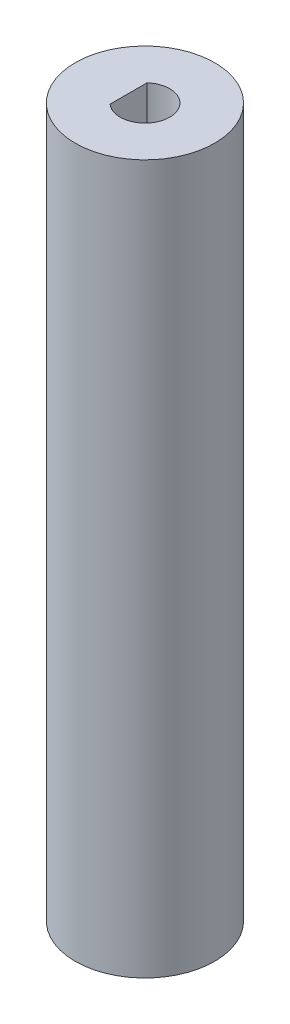
ISO-10303-21;
HEADER;
FILE_DESCRIPTION(('STEP AP214'),'2;1');
FILE_NAME('part.step','',(''),(''),'','','');
FILE_SCHEMA(('AUTOMOTIVE_DESIGN { 1 0 10303 214 1 1 1 1 }'));
ENDSEC;
DATA;
#1=APPLICATION_CONTEXT('core data for automotive mechanical design processes');
#2=APPLICATION_PROTOCOL_DEFINITION('international standard','automotive_design',2000,#1);
#3=PRODUCT_CONTEXT('',#1,'mechanical');
#4=PRODUCT('Part','Part','',(#3));
#5=PRODUCT_RELATED_PRODUCT_CATEGORY('part','',(#4));
#6=PRODUCT_DEFINITION_FORMATION('','',#4);
#7=PRODUCT_DEFINITION_CONTEXT('part definition',#1,'design');
#8=PRODUCT_DEFINITION('design','',#6,#7);
#9=PRODUCT_DEFINITION_SHAPE('','',#8);
#10=(LENGTH_UNIT() NAMED_UNIT(*) SI_UNIT(.MILLI.,.METRE.));
#11=(NAMED_UNIT(*) PLANE_ANGLE_UNIT() SI_UNIT($,.RADIAN.));
#12=(NAMED_UNIT(*) SI_UNIT($,.STERADIAN.) SOLID_ANGLE_UNIT());
#13=UNCERTAINTY_MEASURE_WITH_UNIT(LENGTH_MEASURE(1.E-05),#10,'distance_accuracy_value','');
#14=(GEOMETRIC_REPRESENTATION_CONTEXT(3) GLOBAL_UNCERTAINTY_ASSIGNED_CONTEXT((#13)) GLOBAL_UNIT_ASSIGNED_CONTEXT((#10,
#11,#12)) REPRESENTATION_CONTEXT('',''));
#15=CARTESIAN_POINT('',(0.,0.,0.));
#16=DIRECTION('',(0.,0.,1.));
#17=DIRECTION('',(1.,0.,0.));
#18=AXIS2_PLACEMENT_3D('',#15,#16,#17);
#19=CARTESIAN_POINT('',(0.,50.8,0.));
#20=DIRECTION('',(0.,1.,0.));
#21=DIRECTION('',(0.,0.,1.));
#22=AXIS2_PLACEMENT_3D('',#19,#20,#21);
#23=PLANE('',#22);
#24=CARTESIAN_POINT('',(0.,50.8,0.));
#25=DIRECTION('',(0.,1.,0.));
#26=DIRECTION('',(0.,0.,1.));
#27=AXIS2_PLACEMENT_3D('',#24,#25,#26);
#28=CIRCLE('',#27,5.);
#29=CARTESIAN_POINT('',(0.,50.8,5.));
#30=VERTEX_POINT('',#29);
#31=EDGE_CURVE('E11',#30,#30,#28,.T.);
#32=ORIENTED_EDGE('',*,*,#31,.T.);
#33=EDGE_LOOP('',(#32));
#34=FACE_BOUND('',#33,.T.);
#35=DIRECTION('',(0.,0.,1.));
#36=VECTOR('',#35,1.);
#37=CARTESIAN_POINT('',(-1.176,50.8,-1.32819426289982));
#38=LINE('',#37,#36);
#39=CARTESIAN_POINT('',(-1.176,50.8,-1.32819426289982));
#40=VERTEX_POINT('',#39);
#41=CARTESIAN_POINT('',(-1.176,50.8,1.32819426289982));
#42=VERTEX_POINT('',#41);
#43=EDGE_CURVE('E74',#40,#42,#38,.T.);
#44=ORIENTED_EDGE('',*,*,#43,.F.);
#45=CARTESIAN_POINT('',(0.,50.8,0.));
#46=DIRECTION('',(0.,1.,0.));
#47=DIRECTION('',(0.,0.,1.));
#48=AXIS2_PLACEMENT_3D('',#45,#46,#47);
#49=CIRCLE('',#48,1.774);
#50=EDGE_CURVE('E65',#42,#40,#49,.T.);
#51=ORIENTED_EDGE('',*,*,#50,.F.);
#52=EDGE_LOOP('',(#44,#51));
#53=FACE_BOUND('',#52,.T.);
#54=ADVANCED_FACE('F33',(#34,#53),#23,.T.);
#55=CARTESIAN_POINT('',(0.,0.,0.));
#56=DIRECTION('',(0.,1.,0.));
#57=DIRECTION('',(0.,0.,1.));
#58=AXIS2_PLACEMENT_3D('',#55,#56,#57);
#59=PLANE('',#58);
#60=CARTESIAN_POINT('',(0.,0.,0.));
#61=DIRECTION('',(0.,1.,0.));
#62=DIRECTION('',(0.,0.,1.));
#63=AXIS2_PLACEMENT_3D('',#60,#61,#62);
#64=CIRCLE('',#63,5.);
#65=CARTESIAN_POINT('',(0.,0.,5.));
#66=VERTEX_POINT('',#65);
#67=EDGE_CURVE('E37',#66,#66,#64,.T.);
#68=ORIENTED_EDGE('',*,*,#67,.F.);
#69=EDGE_LOOP('',(#68));
#70=FACE_BOUND('',#69,.T.);
#71=CARTESIAN_POINT('',(0.,0.,0.));
#72=DIRECTION('',(0.,1.,0.));
#73=DIRECTION('',(0.,0.,1.));
#74=AXIS2_PLACEMENT_3D('',#71,#72,#73);
#75=CIRCLE('',#74,1.774);
#76=CARTESIAN_POINT('',(-1.176,0.,1.32819426289982));
#77=VERTEX_POINT('',#76);
#78=CARTESIAN_POINT('',(-1.176,0.,-1.32819426289982));
#79=VERTEX_POINT('',#78);
#80=EDGE_CURVE('E55',#77,#79,#75,.T.);
#81=ORIENTED_EDGE('',*,*,#80,.T.);
#82=DIRECTION('',(0.,0.,1.));
#83=VECTOR('',#82,1.);
#84=CARTESIAN_POINT('',(-1.176,0.,-1.32819426289982));
#85=LINE('',#84,#83);
#86=EDGE_CURVE('E61',#79,#77,#85,.T.);
#87=ORIENTED_EDGE('',*,*,#86,.T.);
#88=EDGE_LOOP('',(#81,#87));
#89=FACE_BOUND('',#88,.T.);
#90=ADVANCED_FACE('F71',(#70,#89),#59,.F.);
#91=CARTESIAN_POINT('',(0.,50.8,0.));
#92=DIRECTION('',(0.,-1.,0.));
#93=DIRECTION('',(0.,0.,-1.));
#94=AXIS2_PLACEMENT_3D('',#91,#92,#93);
#95=CYLINDRICAL_SURFACE('',#94,5.);
#96=ORIENTED_EDGE('',*,*,#31,.F.);
#97=EDGE_LOOP('',(#96));
#98=FACE_BOUND('',#97,.T.);
#99=ORIENTED_EDGE('',*,*,#67,.T.);
#100=EDGE_LOOP('',(#99));
#101=FACE_BOUND('',#100,.T.);
#102=ADVANCED_FACE('F35',(#98,#101),#95,.T.);
#103=CARTESIAN_POINT('',(0.,50.8,0.));
#104=DIRECTION('',(0.,-1.,0.));
#105=DIRECTION('',(0.,0.,-1.));
#106=AXIS2_PLACEMENT_3D('',#103,#104,#105);
#107=CYLINDRICAL_SURFACE('',#106,1.774);
#108=ORIENTED_EDGE('',*,*,#80,.F.);
#109=DIRECTION('',(0.,-1.,0.));
#110=VECTOR('',#109,1.);
#111=CARTESIAN_POINT('',(-1.176,50.8,1.32819426289982));
#112=LINE('',#111,#110);
#113=EDGE_CURVE('E63',#42,#77,#112,.T.);
#114=ORIENTED_EDGE('',*,*,#113,.F.);
#115=ORIENTED_EDGE('',*,*,#50,.T.);
#116=DIRECTION('',(0.,-1.,0.));
#117=VECTOR('',#116,1.);
#118=CARTESIAN_POINT('',(-1.176,50.8,-1.32819426289982));
#119=LINE('',#118,#117);
#120=EDGE_CURVE('E48',#40,#79,#119,.T.);
#121=ORIENTED_EDGE('',*,*,#120,.T.);
#122=EDGE_LOOP('',(#108,#114,#115,#121));
#123=FACE_BOUND('',#122,.T.);
#124=ADVANCED_FACE('F67',(#123),#107,.F.);
#125=CARTESIAN_POINT('',(-1.176,50.8,-1.32819426289982));
#126=DIRECTION('',(1.,0.,0.));
#127=DIRECTION('',(0.,0.,-1.));
#128=AXIS2_PLACEMENT_3D('',#125,#126,#127);
#129=PLANE('',#128);
#130=ORIENTED_EDGE('',*,*,#86,.F.);
#131=ORIENTED_EDGE('',*,*,#120,.F.);
#132=ORIENTED_EDGE('',*,*,#43,.T.);
#133=ORIENTED_EDGE('',*,*,#113,.T.);
#134=EDGE_LOOP('',(#130,#131,#132,#133));
#135=FACE_BOUND('',#134,.T.);
#136=ADVANCED_FACE('F62',(#135),#129,.T.);
#137=CLOSED_SHELL('',(#54,#90,#102,#124,#136));
#138=MANIFOLD_SOLID_BREP('B2',#137);
#139=ADVANCED_BREP_SHAPE_REPRESENTATION('',(#18,#138),#14);
#140=SHAPE_DEFINITION_REPRESENTATION(#9,#139);
ENDSEC;
END-ISO-10303-21;
